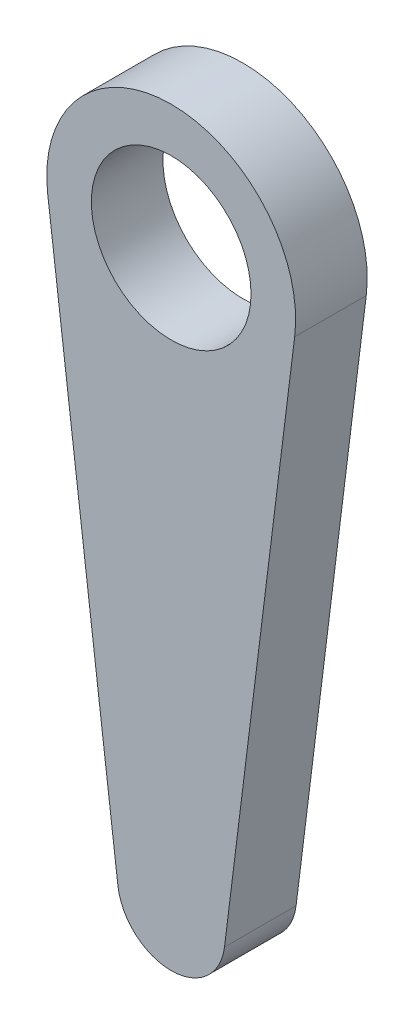
ISO-10303-21;
HEADER;
FILE_DESCRIPTION(('STEP AP214'),'2;1');
FILE_NAME('part.step','',(''),(''),'','','');
FILE_SCHEMA(('AUTOMOTIVE_DESIGN { 1 0 10303 214 1 1 1 1 }'));
ENDSEC;
DATA;
#1=APPLICATION_CONTEXT('core data for automotive mechanical design processes');
#2=APPLICATION_PROTOCOL_DEFINITION('international standard','automotive_design',2000,#1);
#3=PRODUCT_CONTEXT('',#1,'mechanical');
#4=PRODUCT('Part','Part','',(#3));
#5=PRODUCT_RELATED_PRODUCT_CATEGORY('part','',(#4));
#6=PRODUCT_DEFINITION_FORMATION('','',#4);
#7=PRODUCT_DEFINITION_CONTEXT('part definition',#1,'design');
#8=PRODUCT_DEFINITION('design','',#6,#7);
#9=PRODUCT_DEFINITION_SHAPE('','',#8);
#10=(LENGTH_UNIT() NAMED_UNIT(*) SI_UNIT(.MILLI.,.METRE.));
#11=(NAMED_UNIT(*) PLANE_ANGLE_UNIT() SI_UNIT($,.RADIAN.));
#12=(NAMED_UNIT(*) SI_UNIT($,.STERADIAN.) SOLID_ANGLE_UNIT());
#13=UNCERTAINTY_MEASURE_WITH_UNIT(LENGTH_MEASURE(1.E-05),#10,'distance_accuracy_value','');
#14=(GEOMETRIC_REPRESENTATION_CONTEXT(3) GLOBAL_UNCERTAINTY_ASSIGNED_CONTEXT((#13)) GLOBAL_UNIT_ASSIGNED_CONTEXT((#10,
#11,#12)) REPRESENTATION_CONTEXT('',''));
#15=CARTESIAN_POINT('',(0.,0.,0.));
#16=DIRECTION('',(0.,0.,1.));
#17=DIRECTION('',(1.,0.,0.));
#18=AXIS2_PLACEMENT_3D('',#15,#16,#17);
#19=CARTESIAN_POINT('',(-3.44837431904287,-0.429347826086957,2.));
#20=DIRECTION('',(0.992337933537518,0.123553331248045,0.));
#21=DIRECTION('',(-0.123553331248045,0.992337933537518,0.));
#22=AXIS2_PLACEMENT_3D('',#19,#20,#21);
#23=PLANE('',#22);
#24=DIRECTION('',(0.123553331248045,-0.992337933537518,0.));
#25=VECTOR('',#24,1.);
#26=CARTESIAN_POINT('',(-3.44837431904287,-0.429347826086957,0.));
#27=LINE('',#26,#25);
#28=CARTESIAN_POINT('',(-3.44837431904287,-0.429347826086957,0.));
#29=VERTEX_POINT('',#28);
#30=CARTESIAN_POINT('',(-1.48850690030627,-16.1703299968721,0.));
#31=VERTEX_POINT('',#30);
#32=EDGE_CURVE('E100',#29,#31,#27,.T.);
#33=ORIENTED_EDGE('',*,*,#32,.T.);
#34=DIRECTION('',(0.,0.,-1.));
#35=VECTOR('',#34,1.);
#36=CARTESIAN_POINT('',(-1.48850690030627,-16.1703299968721,2.));
#37=LINE('',#36,#35);
#38=CARTESIAN_POINT('',(-1.48850690030627,-16.1703299968721,2.));
#39=VERTEX_POINT('',#38);
#40=EDGE_CURVE('E11',#39,#31,#37,.T.);
#41=ORIENTED_EDGE('',*,*,#40,.F.);
#42=DIRECTION('',(0.123553331248045,-0.992337933537518,0.));
#43=VECTOR('',#42,1.);
#44=CARTESIAN_POINT('',(-3.44837431904287,-0.429347826086957,2.));
#45=LINE('',#44,#43);
#46=CARTESIAN_POINT('',(-3.44837431904287,-0.429347826086957,2.));
#47=VERTEX_POINT('',#46);
#48=EDGE_CURVE('E82',#47,#39,#45,.T.);
#49=ORIENTED_EDGE('',*,*,#48,.F.);
#50=DIRECTION('',(0.,0.,-1.));
#51=VECTOR('',#50,1.);
#52=CARTESIAN_POINT('',(-3.44837431904287,-0.429347826086957,2.));
#53=LINE('',#52,#51);
#54=EDGE_CURVE('E93',#47,#29,#53,.T.);
#55=ORIENTED_EDGE('',*,*,#54,.T.);
#56=EDGE_LOOP('',(#33,#41,#49,#55));
#57=FACE_BOUND('',#56,.T.);
#58=ADVANCED_FACE('F34',(#57),#23,.F.);
#59=CARTESIAN_POINT('',(0.,-15.985,2.));
#60=DIRECTION('',(0.,0.,-1.));
#61=DIRECTION('',(-1.,0.,0.));
#62=AXIS2_PLACEMENT_3D('',#59,#60,#61);
#63=CYLINDRICAL_SURFACE('',#62,1.5);
#64=CARTESIAN_POINT('',(0.,-15.985,0.));
#65=DIRECTION('',(0.,0.,1.));
#66=DIRECTION('',(1.,0.,0.));
#67=AXIS2_PLACEMENT_3D('',#64,#65,#66);
#68=CIRCLE('',#67,1.5);
#69=CARTESIAN_POINT('',(1.48850690030628,-16.1703299968721,0.));
#70=VERTEX_POINT('',#69);
#71=EDGE_CURVE('E87',#31,#70,#68,.T.);
#72=ORIENTED_EDGE('',*,*,#71,.T.);
#73=DIRECTION('',(0.,0.,-1.));
#74=VECTOR('',#73,1.);
#75=CARTESIAN_POINT('',(1.48850690030628,-16.1703299968721,2.));
#76=LINE('',#75,#74);
#77=CARTESIAN_POINT('',(1.48850690030628,-16.1703299968721,2.));
#78=VERTEX_POINT('',#77);
#79=EDGE_CURVE('E43',#78,#70,#76,.T.);
#80=ORIENTED_EDGE('',*,*,#79,.F.);
#81=CARTESIAN_POINT('',(0.,-15.985,2.));
#82=DIRECTION('',(0.,0.,1.));
#83=DIRECTION('',(1.,0.,0.));
#84=AXIS2_PLACEMENT_3D('',#81,#82,#83);
#85=CIRCLE('',#84,1.5);
#86=EDGE_CURVE('E77',#39,#78,#85,.T.);
#87=ORIENTED_EDGE('',*,*,#86,.F.);
#88=ORIENTED_EDGE('',*,*,#40,.T.);
#89=EDGE_LOOP('',(#72,#80,#87,#88));
#90=FACE_BOUND('',#89,.T.);
#91=ADVANCED_FACE('F86',(#90),#63,.T.);
#92=CARTESIAN_POINT('',(3.44837431904287,-0.429347826086956,2.));
#93=DIRECTION('',(0.992337933537518,-0.123553331248045,0.));
#94=DIRECTION('',(0.123553331248045,0.992337933537518,0.));
#95=AXIS2_PLACEMENT_3D('',#92,#93,#94);
#96=PLANE('',#95);
#97=DIRECTION('',(-0.123553331248045,-0.992337933537518,0.));
#98=VECTOR('',#97,1.);
#99=CARTESIAN_POINT('',(3.44837431904287,-0.429347826086956,0.));
#100=LINE('',#99,#98);
#101=CARTESIAN_POINT('',(3.44837431904287,-0.429347826086956,0.));
#102=VERTEX_POINT('',#101);
#103=EDGE_CURVE('E104',#102,#70,#100,.T.);
#104=ORIENTED_EDGE('',*,*,#103,.F.);
#105=DIRECTION('',(0.,0.,-1.));
#106=VECTOR('',#105,1.);
#107=CARTESIAN_POINT('',(3.44837431904287,-0.429347826086956,2.));
#108=LINE('',#107,#106);
#109=CARTESIAN_POINT('',(3.44837431904287,-0.429347826086956,2.));
#110=VERTEX_POINT('',#109);
#111=EDGE_CURVE('E67',#110,#102,#108,.T.);
#112=ORIENTED_EDGE('',*,*,#111,.F.);
#113=DIRECTION('',(-0.123553331248045,-0.992337933537518,0.));
#114=VECTOR('',#113,1.);
#115=CARTESIAN_POINT('',(3.44837431904287,-0.429347826086956,2.));
#116=LINE('',#115,#114);
#117=EDGE_CURVE('E80',#110,#78,#116,.T.);
#118=ORIENTED_EDGE('',*,*,#117,.T.);
#119=ORIENTED_EDGE('',*,*,#79,.T.);
#120=EDGE_LOOP('',(#104,#112,#118,#119));
#121=FACE_BOUND('',#120,.T.);
#122=ADVANCED_FACE('F91',(#121),#96,.T.);
#123=CARTESIAN_POINT('',(0.,0.,2.));
#124=DIRECTION('',(0.,0.,-1.));
#125=DIRECTION('',(-1.,0.,0.));
#126=AXIS2_PLACEMENT_3D('',#123,#124,#125);
#127=CYLINDRICAL_SURFACE('',#126,2.23);
#128=CARTESIAN_POINT('',(0.,0.,2.));
#129=DIRECTION('',(0.,0.,1.));
#130=DIRECTION('',(1.,0.,0.));
#131=AXIS2_PLACEMENT_3D('',#128,#129,#130);
#132=CIRCLE('',#131,2.23);
#133=CARTESIAN_POINT('',(2.23,0.,2.));
#134=VERTEX_POINT('',#133);
#135=EDGE_CURVE('E107',#134,#134,#132,.T.);
#136=ORIENTED_EDGE('',*,*,#135,.T.);
#137=EDGE_LOOP('',(#136));
#138=FACE_BOUND('',#137,.T.);
#139=CARTESIAN_POINT('',(0.,0.,0.));
#140=DIRECTION('',(0.,0.,1.));
#141=DIRECTION('',(1.,0.,0.));
#142=AXIS2_PLACEMENT_3D('',#139,#140,#141);
#143=CIRCLE('',#142,2.23);
#144=CARTESIAN_POINT('',(2.23,0.,0.));
#145=VERTEX_POINT('',#144);
#146=EDGE_CURVE('E97',#145,#145,#143,.T.);
#147=ORIENTED_EDGE('',*,*,#146,.F.);
#148=EDGE_LOOP('',(#147));
#149=FACE_BOUND('',#148,.T.);
#150=ADVANCED_FACE('F36',(#138,#149),#127,.F.);
#151=CARTESIAN_POINT('',(0.,0.,2.));
#152=DIRECTION('',(0.,0.,-1.));
#153=DIRECTION('',(-1.,0.,0.));
#154=AXIS2_PLACEMENT_3D('',#151,#152,#153);
#155=CYLINDRICAL_SURFACE('',#154,3.475);
#156=CARTESIAN_POINT('',(0.,0.,0.));
#157=DIRECTION('',(0.,0.,1.));
#158=DIRECTION('',(1.,0.,0.));
#159=AXIS2_PLACEMENT_3D('',#156,#157,#158);
#160=CIRCLE('',#159,3.475);
#161=EDGE_CURVE('E70',#102,#29,#160,.T.);
#162=ORIENTED_EDGE('',*,*,#161,.T.);
#163=ORIENTED_EDGE('',*,*,#54,.F.);
#164=CARTESIAN_POINT('',(0.,0.,2.));
#165=DIRECTION('',(0.,0.,1.));
#166=DIRECTION('',(1.,0.,0.));
#167=AXIS2_PLACEMENT_3D('',#164,#165,#166);
#168=CIRCLE('',#167,3.475);
#169=EDGE_CURVE('E51',#110,#47,#168,.T.);
#170=ORIENTED_EDGE('',*,*,#169,.F.);
#171=ORIENTED_EDGE('',*,*,#111,.T.);
#172=EDGE_LOOP('',(#162,#163,#170,#171));
#173=FACE_BOUND('',#172,.T.);
#174=ADVANCED_FACE('F119',(#173),#155,.T.);
#175=CARTESIAN_POINT('',(0.,0.,2.));
#176=DIRECTION('',(0.,0.,1.));
#177=DIRECTION('',(1.,0.,0.));
#178=AXIS2_PLACEMENT_3D('',#175,#176,#177);
#179=PLANE('',#178);
#180=ORIENTED_EDGE('',*,*,#135,.F.);
#181=EDGE_LOOP('',(#180));
#182=FACE_BOUND('',#181,.T.);
#183=ORIENTED_EDGE('',*,*,#48,.T.);
#184=ORIENTED_EDGE('',*,*,#86,.T.);
#185=ORIENTED_EDGE('',*,*,#117,.F.);
#186=ORIENTED_EDGE('',*,*,#169,.T.);
#187=EDGE_LOOP('',(#183,#184,#185,#186));
#188=FACE_BOUND('',#187,.T.);
#189=ADVANCED_FACE('F78',(#182,#188),#179,.T.);
#190=CARTESIAN_POINT('',(0.,0.,0.));
#191=DIRECTION('',(0.,0.,1.));
#192=DIRECTION('',(1.,0.,0.));
#193=AXIS2_PLACEMENT_3D('',#190,#191,#192);
#194=PLANE('',#193);
#195=ORIENTED_EDGE('',*,*,#146,.T.);
#196=EDGE_LOOP('',(#195));
#197=FACE_BOUND('',#196,.T.);
#198=ORIENTED_EDGE('',*,*,#32,.F.);
#199=ORIENTED_EDGE('',*,*,#161,.F.);
#200=ORIENTED_EDGE('',*,*,#103,.T.);
#201=ORIENTED_EDGE('',*,*,#71,.F.);
#202=EDGE_LOOP('',(#198,#199,#200,#201));
#203=FACE_BOUND('',#202,.T.);
#204=ADVANCED_FACE('F112',(#197,#203),#194,.F.);
#205=CLOSED_SHELL('',(#58,#91,#122,#150,#174,#189,#204));
#206=MANIFOLD_SOLID_BREP('B2',#205);
#207=ADVANCED_BREP_SHAPE_REPRESENTATION('',(#18,#206),#14);
#208=SHAPE_DEFINITION_REPRESENTATION(#9,#207);
ENDSEC;
END-ISO-10303-21;
